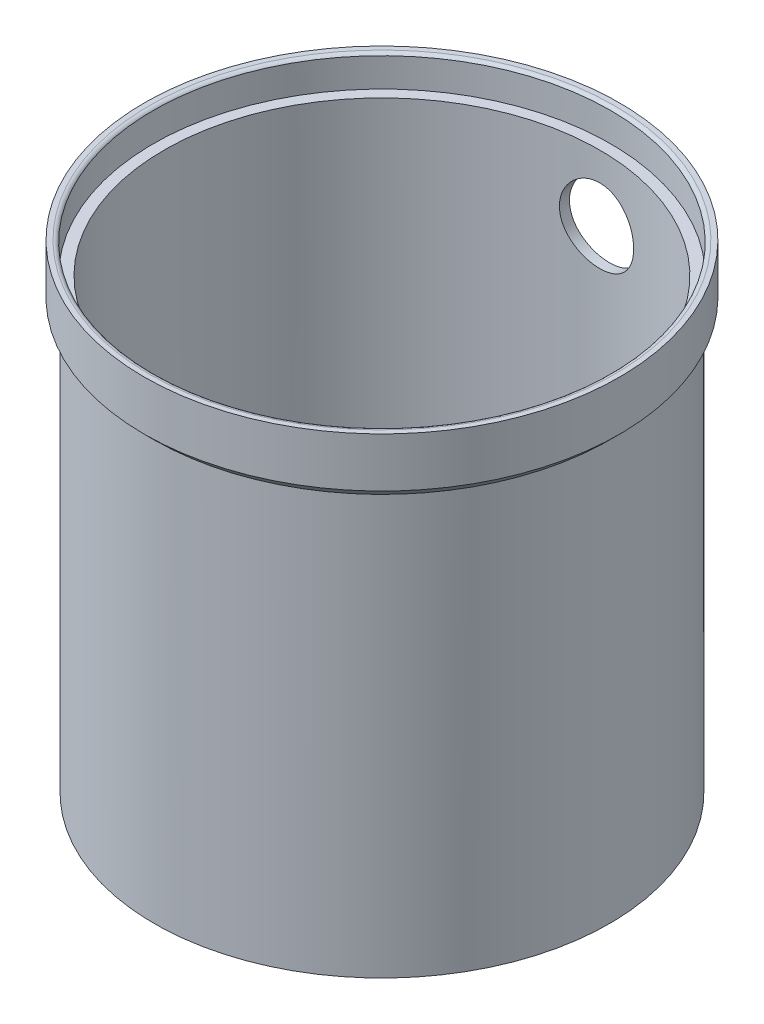
ISO-10303-21;
HEADER;
FILE_DESCRIPTION(('STEP AP214'),'2;1');
FILE_NAME('part.step','',(''),(''),'','','');
FILE_SCHEMA(('AUTOMOTIVE_DESIGN { 1 0 10303 214 1 1 1 1 }'));
ENDSEC;
DATA;
#1=APPLICATION_CONTEXT('core data for automotive mechanical design processes');
#2=APPLICATION_PROTOCOL_DEFINITION('international standard','automotive_design',2000,#1);
#3=PRODUCT_CONTEXT('',#1,'mechanical');
#4=PRODUCT('Part','Part','',(#3));
#5=PRODUCT_RELATED_PRODUCT_CATEGORY('part','',(#4));
#6=PRODUCT_DEFINITION_FORMATION('','',#4);
#7=PRODUCT_DEFINITION_CONTEXT('part definition',#1,'design');
#8=PRODUCT_DEFINITION('design','',#6,#7);
#9=PRODUCT_DEFINITION_SHAPE('','',#8);
#10=(LENGTH_UNIT() NAMED_UNIT(*) SI_UNIT(.MILLI.,.METRE.));
#11=(NAMED_UNIT(*) PLANE_ANGLE_UNIT() SI_UNIT($,.RADIAN.));
#12=(NAMED_UNIT(*) SI_UNIT($,.STERADIAN.) SOLID_ANGLE_UNIT());
#13=UNCERTAINTY_MEASURE_WITH_UNIT(LENGTH_MEASURE(1.E-05),#10,'distance_accuracy_value','');
#14=(GEOMETRIC_REPRESENTATION_CONTEXT(3) GLOBAL_UNCERTAINTY_ASSIGNED_CONTEXT((#13)) GLOBAL_UNIT_ASSIGNED_CONTEXT((#10,
#11,#12)) REPRESENTATION_CONTEXT('',''));
#15=CARTESIAN_POINT('',(0.,0.,0.));
#16=DIRECTION('',(0.,0.,1.));
#17=DIRECTION('',(1.,0.,0.));
#18=AXIS2_PLACEMENT_3D('',#15,#16,#17);
#19=CARTESIAN_POINT('',(0.,74.2,0.));
#20=DIRECTION('',(0.,1.,0.));
#21=DIRECTION('',(0.,0.,1.));
#22=AXIS2_PLACEMENT_3D('',#19,#20,#21);
#23=TOROIDAL_SURFACE('',#22,37.6,0.8);
#24=CARTESIAN_POINT('',(0.,75.,0.));
#25=DIRECTION('',(0.,1.,0.));
#26=DIRECTION('',(0.,0.,1.));
#27=AXIS2_PLACEMENT_3D('',#24,#25,#26);
#28=CIRCLE('',#27,37.6);
#29=CARTESIAN_POINT('',(0.,75.,37.6));
#30=VERTEX_POINT('',#29);
#31=EDGE_CURVE('E43',#30,#30,#28,.F.);
#32=ORIENTED_EDGE('',*,*,#31,.F.);
#33=EDGE_LOOP('',(#32));
#34=FACE_BOUND('',#33,.T.);
#35=CARTESIAN_POINT('',(0.,74.6663689526545,0.));
#36=DIRECTION('',(0.,-1.,0.));
#37=DIRECTION('',(0.,0.,-1.));
#38=AXIS2_PLACEMENT_3D('',#35,#36,#37);
#39=CIRCLE('',#38,36.95);
#40=CARTESIAN_POINT('',(0.,74.6663689526545,-36.95));
#41=VERTEX_POINT('',#40);
#42=EDGE_CURVE('E39',#41,#41,#39,.T.);
#43=ORIENTED_EDGE('',*,*,#42,.T.);
#44=EDGE_LOOP('',(#43));
#45=FACE_BOUND('',#44,.T.);
#46=ADVANCED_FACE('F35',(#34,#45),#23,.T.);
#47=CARTESIAN_POINT('',(0.,70.,0.));
#48=DIRECTION('',(0.,-1.,0.));
#49=DIRECTION('',(0.,0.,-1.));
#50=AXIS2_PLACEMENT_3D('',#47,#48,#49);
#51=CYLINDRICAL_SURFACE('',#50,36.8);
#52=CARTESIAN_POINT('',(0.,65.4,0.));
#53=DIRECTION('',(0.,1.,0.));
#54=DIRECTION('',(0.,0.,1.));
#55=AXIS2_PLACEMENT_3D('',#52,#53,#54);
#56=CIRCLE('',#55,36.8);
#57=CARTESIAN_POINT('',(0.,65.4,-36.8));
#58=VERTEX_POINT('',#57);
#59=EDGE_CURVE('E122',#58,#58,#56,.F.);
#60=ORIENTED_EDGE('',*,*,#59,.T.);
#61=CARTESIAN_POINT('',(0.,65.4,-36.8));
#62=CARTESIAN_POINT('',(-0.167379502400647,65.4000025104169,-36.8000010705405));
#63=CARTESIAN_POINT('',(-0.334724755541256,65.3929938209701,-36.7988559176553));
#64=CARTESIAN_POINT('',(-0.668265105705263,65.3650165208069,-36.794309602854));
#65=CARTESIAN_POINT('',(-0.834459965001257,65.3440451068931,-36.7909079879245));
#66=CARTESIAN_POINT('',(-1.16455937968949,65.2882801792838,-36.781939732632));
#67=CARTESIAN_POINT('',(-1.32846239464322,65.2534777918275,-36.7763717023751));
#68=CARTESIAN_POINT('',(-1.65277006004401,65.1703018453572,-36.7632247953928));
#69=CARTESIAN_POINT('',(-1.81317340375014,65.1219233075465,-36.7556451810122));
#70=CARTESIAN_POINT('',(-2.12910212654443,65.0120285046059,-36.738697891564));
#71=CARTESIAN_POINT('',(-2.28463305287706,64.9505278523386,-36.7293323428194));
#72=CARTESIAN_POINT('',(-2.58999374281213,64.8147817012781,-36.7090637018151));
#73=CARTESIAN_POINT('',(-2.73982138057351,64.7405315059694,-36.698160043231));
#74=CARTESIAN_POINT('',(-3.03261373380982,64.579876891852,-36.6751252372869));
#75=CARTESIAN_POINT('',(-3.17558185057908,64.4934785819974,-36.6629947077421));
#76=CARTESIAN_POINT('',(-3.45381710777184,64.3090745648335,-36.6378311365647));
#77=CARTESIAN_POINT('',(-3.58908135831187,64.2110645436395,-36.6247977602657));
#78=CARTESIAN_POINT('',(-3.85196561832089,64.0033298393285,-36.5980867841785));
#79=CARTESIAN_POINT('',(-3.9795174106852,63.8935193665289,-36.5844049360367));
#80=CARTESIAN_POINT('',(-4.22498502900374,63.6635429103554,-36.5568702765524));
#81=CARTESIAN_POINT('',(-4.34289727035992,63.5433731085449,-36.5430174037964));
#82=CARTESIAN_POINT('',(-4.56818760812465,63.2935769529694,-36.5155383331682));
#83=CARTESIAN_POINT('',(-4.67556890914976,63.1639534970648,-36.5019120673931));
#84=CARTESIAN_POINT('',(-4.87912940730948,62.8960561507011,-36.4752606655068));
#85=CARTESIAN_POINT('',(-4.97530445823978,62.7577790873928,-36.4622357529598));
#86=CARTESIAN_POINT('',(-5.15622628368947,62.4727796492382,-36.4370926742023));
#87=CARTESIAN_POINT('',(-5.24090701038183,62.326014851213,-36.4249799129024));
#88=CARTESIAN_POINT('',(-5.39762195948985,62.0257147319839,-36.4020871800492));
#89=CARTESIAN_POINT('',(-5.46965145959476,61.8721769092621,-36.3913077066129));
#90=CARTESIAN_POINT('',(-5.60046245278367,61.5595158683461,-36.3714064958991));
#91=CARTESIAN_POINT('',(-5.65924951049938,61.4003950288112,-36.3622840626268));
#92=CARTESIAN_POINT('',(-5.76318483858863,61.0776470561121,-36.3459547656866));
#93=CARTESIAN_POINT('',(-5.80832812645802,60.9140183004678,-36.3387486019273));
#94=CARTESIAN_POINT('',(-5.92198666129998,60.4211637322987,-36.3204660588543));
#95=CARTESIAN_POINT('',(-5.97003784893662,60.0868327523692,-36.3125197098996));
#96=CARTESIAN_POINT('',(-6.00942380550643,59.4149495845593,-36.306021300474));
#97=CARTESIAN_POINT('',(-6.00076241618712,59.0773976164176,-36.3074686036708));
#98=CARTESIAN_POINT('',(-5.92744685517449,58.4119400719097,-36.319508645484));
#99=CARTESIAN_POINT('',(-5.863345068187,58.0839722278961,-36.330011158617));
#100=CARTESIAN_POINT('',(-5.68181456574631,57.4435227637854,-36.3588414200932));
#101=CARTESIAN_POINT('',(-5.56438409324843,57.1310416543131,-36.3771694262653));
#102=CARTESIAN_POINT('',(-5.27897154123598,56.5287598165481,-36.4196824154256));
#103=CARTESIAN_POINT('',(-5.11075898527784,56.239070249099,-36.4438940014251));
#104=CARTESIAN_POINT('',(-4.72871951907739,55.6918204370566,-36.4954277860605));
#105=CARTESIAN_POINT('',(-4.51488908225229,55.4342626789189,-36.5227502251109));
#106=CARTESIAN_POINT('',(-4.04466849399494,54.9553871821923,-36.5778241829149));
#107=CARTESIAN_POINT('',(-3.78780404411893,54.73453504619,-36.6055769496218));
#108=CARTESIAN_POINT('',(-3.24041367380291,54.3389981898965,-36.6580849555046));
#109=CARTESIAN_POINT('',(-2.94988755343645,54.1643137438288,-36.6828401768755));
#110=CARTESIAN_POINT('',(-2.34299078956486,53.8660326453873,-36.726596809978));
#111=CARTESIAN_POINT('',(-2.02660016471902,53.7424759464937,-36.7455937188211));
#112=CARTESIAN_POINT('',(-1.37717986164191,53.5503835948365,-36.7756568252604));
#113=CARTESIAN_POINT('',(-1.04415151705093,53.4818435395617,-36.7867236574251));
#114=CARTESIAN_POINT('',(-0.374923533469688,53.40235852658,-36.7995946401197));
#115=CARTESIAN_POINT('',(-0.0388017431908669,53.3907741790613,-36.8015016143988));
#116=CARTESIAN_POINT('',(0.630581028563658,53.4238264834979,-36.7961192525689));
#117=CARTESIAN_POINT('',(0.963842114770074,53.4684610683572,-36.7888302545835));
#118=CARTESIAN_POINT('',(1.61607710562687,53.6121524127982,-36.7659385880065));
#119=CARTESIAN_POINT('',(1.93512233484675,53.7108937611208,-36.7503841181009));
#120=CARTESIAN_POINT('',(2.55213018743915,53.9596603945014,-36.7126988884816));
#121=CARTESIAN_POINT('',(2.85009166847176,54.1096884557639,-36.6905677727755));
#122=CARTESIAN_POINT('',(3.41925906692175,54.4582418928705,-36.6419301321133));
#123=CARTESIAN_POINT('',(3.69021644296168,54.6571680662361,-36.6153880665172));
#124=CARTESIAN_POINT('',(4.19513081681129,55.097319311781,-36.5609831106165));
#125=CARTESIAN_POINT('',(4.42908524745295,55.3385473163053,-36.5331201288442));
#126=CARTESIAN_POINT('',(4.85571329917306,55.8593130612828,-36.4788824655137));
#127=CARTESIAN_POINT('',(5.0479556734624,56.1392061601435,-36.4525252328465));
#128=CARTESIAN_POINT('',(5.38269242814043,56.7277018817876,-36.4046060604531));
#129=CARTESIAN_POINT('',(5.52518833546757,57.0363036230078,-36.3830439735501));
#130=CARTESIAN_POINT('',(5.75574261255356,57.6721687549556,-36.3472839276365));
#131=CARTESIAN_POINT('',(5.84401838867326,57.9993517933673,-36.3330565958599));
#132=CARTESIAN_POINT('',(5.96429150260154,58.6643388789088,-36.3135112361705));
#133=CARTESIAN_POINT('',(5.99629350282524,59.0021420437752,-36.3081924701637));
#134=CARTESIAN_POINT('',(6.0013829696215,59.506917538766,-36.307343956729));
#135=CARTESIAN_POINT('',(5.9960723149273,59.6739383859752,-36.3082252880731));
#136=CARTESIAN_POINT('',(5.97155493405967,60.0069123779766,-36.3122669850973));
#137=CARTESIAN_POINT('',(5.95235342441563,60.1728658999922,-36.3154264952355));
#138=CARTESIAN_POINT('',(5.90018554405459,60.5025860498475,-36.3239383162528));
#139=CARTESIAN_POINT('',(5.86721424825465,60.666351873556,-36.3292914117055));
#140=CARTESIAN_POINT('',(5.78777470241246,60.9904352320881,-36.3420319047357));
#141=CARTESIAN_POINT('',(5.74131131553284,61.1507539870682,-36.3494185692728));
#142=CARTESIAN_POINT('',(5.63526736787457,61.466765819258,-36.3660093498908));
#143=CARTESIAN_POINT('',(5.57569622448701,61.6224621268231,-36.3752121606573));
#144=CARTESIAN_POINT('',(5.44387744359313,61.9282216321091,-36.3951732731103));
#145=CARTESIAN_POINT('',(5.37163435269657,62.0782868268716,-36.4059310166545));
#146=CARTESIAN_POINT('',(5.2149434841611,62.3718786316506,-36.4287061407479));
#147=CARTESIAN_POINT('',(5.13049095147288,62.515402665392,-36.4407240115589));
#148=CARTESIAN_POINT('',(4.95002708145606,62.7948320608544,-36.4656759557506));
#149=CARTESIAN_POINT('',(4.85401981640323,62.9307400821082,-36.4786097056872));
#150=CARTESIAN_POINT('',(4.64989148294004,63.195628309231,-36.5051944659567));
#151=CARTESIAN_POINT('',(4.54164151522518,63.3245085371675,-36.5188521107623));
#152=CARTESIAN_POINT('',(4.31475373212098,63.5726677129873,-36.546353447211));
#153=CARTESIAN_POINT('',(4.19611964582905,63.6919500783166,-36.5601970705667));
#154=CARTESIAN_POINT('',(3.94917093008504,63.9202143234384,-36.5876958685921));
#155=CARTESIAN_POINT('',(3.82085056285604,64.0291900104795,-36.6013509258074));
#156=CARTESIAN_POINT('',(3.55552009560744,64.2359648172348,-36.6280772838614));
#157=CARTESIAN_POINT('',(3.41851322103613,64.3337680481143,-36.6411487983427));
#158=CARTESIAN_POINT('',(3.13572188622102,64.518197108902,-36.6664360961328));
#159=CARTESIAN_POINT('',(2.98988287810668,64.6047402370984,-36.6786452763393));
#160=CARTESIAN_POINT('',(2.69137914128866,64.7651822730117,-36.7017557982771));
#161=CARTESIAN_POINT('',(2.53871694942568,64.8390858315636,-36.7126576206185));
#162=CARTESIAN_POINT('',(2.22769842371621,64.9736924061442,-36.7328411160269));
#163=CARTESIAN_POINT('',(2.06934618292025,65.0344046980366,-36.742123926642));
#164=CARTESIAN_POINT('',(1.74803435793424,65.1422207155977,-36.7588121612646));
#165=CARTESIAN_POINT('',(1.58507578044437,65.1893273898688,-36.7662179920075));
#166=CARTESIAN_POINT('',(1.18829150458764,65.2859974814475,-36.7815414066276));
#167=CARTESIAN_POINT('',(0.952719099418756,65.3286983319468,-36.7884313916199));
#168=CARTESIAN_POINT('',(0.478074481517521,65.3856975708614,-36.7976598874467));
#169=CARTESIAN_POINT('',(0.239002325046639,65.3999964153588,-36.7999984713679));
#170=CARTESIAN_POINT('',(0.,65.4,-36.8));
#171=B_SPLINE_CURVE_WITH_KNOTS('',3,(#61,#62,#63,#64,#65,#66,#67,#68,#69,#70,#71,#72,#73,#74,
#75,#76,#77,#78,#79,#80,#81,#82,#83,#84,#85,#86,#87,#88,#89,#90,#91,#92,#93,#94,#95,#96,#97,#98,
#99,#100,#101,#102,#103,#104,#105,#106,#107,#108,#109,#110,#111,#112,#113,#114,#115,#116,#117,
#118,#119,#120,#121,#122,#123,#124,#125,#126,#127,#128,#129,#130,#131,#132,#133,#134,#135,#136,
#137,#138,#139,#140,#141,#142,#143,#144,#145,#146,#147,#148,#149,#150,#151,#152,#153,#154,#155,
#156,#157,#158,#159,#160,#161,#162,#163,#164,#165,#166,#167,#168,#169,#170),.UNSPECIFIED.,.T.,
.F.,(4,2,2,2,2,2,2,2,2,2,2,2,2,2,2,2,2,2,2,2,2,2,2,2,2,2,2,2,2,2,2,2,2,2,2,2,2,2,2,2,2,2,2,2,2,
2,2,2,2,2,2,2,2,2,4),(0.,0.501929050266932,1.00395889967381,1.50631136580925,2.00884830152795,
2.51079061371921,3.01291822329726,3.51479422377039,4.01685726510777,4.52285504909154,
5.02904014734791,5.53507072991348,6.04128794835958,6.55030083339255,7.05950331522916,
7.56849142331037,8.07766518239634,9.08593060671923,10.0941277311811,11.0923938366255,
12.0906928347882,13.0935925621534,14.0965698488292,15.111432213846,16.1263006067345,
17.1419605717393,18.1575392540598,19.1616905098942,20.1658048454878,21.1641270992055,
22.1625034017335,23.1693530805759,24.1762725814163,25.1931526218697,26.2100014470456,
27.2227459341838,28.2354065090974,28.7362410808246,29.2368876682323,29.7377134770558,
30.2383589891058,30.7386459753685,31.2387538278175,31.7390569779613,32.2391843179849,
32.7451788774095,33.2509924660885,33.7571080665708,34.2630368260105,34.7724936782077,
35.2817626663132,35.7906723781808,36.2994717164988,37.0161911159083,37.7328990060721),.UNSPECIFIED.);
#172=EDGE_CURVE('E47',#58,#58,#171,.T.);
#173=ORIENTED_EDGE('',*,*,#172,.T.);
#174=EDGE_LOOP('',(#60,#173));
#175=FACE_BOUND('',#174,.T.);
#176=CARTESIAN_POINT('',(0.,-2.3,0.));
#177=DIRECTION('',(0.,-1.,0.));
#178=DIRECTION('',(0.,0.,-1.));
#179=AXIS2_PLACEMENT_3D('',#176,#177,#178);
#180=CIRCLE('',#179,36.8);
#181=CARTESIAN_POINT('',(0.,-2.3,-36.8));
#182=VERTEX_POINT('',#181);
#183=EDGE_CURVE('E139',#182,#182,#180,.T.);
#184=ORIENTED_EDGE('',*,*,#183,.F.);
#185=EDGE_LOOP('',(#184));
#186=FACE_BOUND('',#185,.T.);
#187=ADVANCED_FACE('F66',(#175,#186),#51,.T.);
#188=CARTESIAN_POINT('',(0.,70.,0.));
#189=DIRECTION('',(0.,1.,0.));
#190=DIRECTION('',(0.,0.,1.));
#191=AXIS2_PLACEMENT_3D('',#188,#189,#190);
#192=PLANE('',#191);
#193=CARTESIAN_POINT('',(0.,70.,0.));
#194=DIRECTION('',(0.,1.,0.));
#195=DIRECTION('',(0.,0.,1.));
#196=AXIS2_PLACEMENT_3D('',#193,#194,#195);
#197=CIRCLE('',#196,35.2);
#198=CARTESIAN_POINT('',(0.,70.,35.2));
#199=VERTEX_POINT('',#198);
#200=EDGE_CURVE('E126',#199,#199,#197,.T.);
#201=ORIENTED_EDGE('',*,*,#200,.F.);
#202=EDGE_LOOP('',(#201));
#203=FACE_BOUND('',#202,.T.);
#204=CARTESIAN_POINT('',(0.,70.,0.));
#205=DIRECTION('',(0.,1.,0.));
#206=DIRECTION('',(0.,0.,1.));
#207=AXIS2_PLACEMENT_3D('',#204,#205,#206);
#208=CIRCLE('',#207,36.95);
#209=CARTESIAN_POINT('',(0.,70.,36.95));
#210=VERTEX_POINT('',#209);
#211=EDGE_CURVE('E51',#210,#210,#208,.T.);
#212=ORIENTED_EDGE('',*,*,#211,.T.);
#213=EDGE_LOOP('',(#212));
#214=FACE_BOUND('',#213,.T.);
#215=ADVANCED_FACE('F98',(#203,#214),#192,.T.);
#216=CARTESIAN_POINT('',(0.,70.,0.));
#217=DIRECTION('',(0.,-1.,0.));
#218=DIRECTION('',(0.,0.,-1.));
#219=AXIS2_PLACEMENT_3D('',#216,#217,#218);
#220=CYLINDRICAL_SURFACE('',#219,35.2);
#221=CARTESIAN_POINT('',(0.,65.4,-35.2));
#222=CARTESIAN_POINT('',(-0.167269846309063,65.4000026518599,-35.2000011757502));
#223=CARTESIAN_POINT('',(-0.334504090697048,65.3930030682291,-35.1988055093664));
#224=CARTESIAN_POINT('',(-0.667821667675684,65.3650629572513,-35.1940587814457));
#225=CARTESIAN_POINT('',(-0.83390476953724,65.3441197123487,-35.1905072607641));
#226=CARTESIAN_POINT('',(-1.16377612249944,65.2884316216283,-35.1811437864091));
#227=CARTESIAN_POINT('',(-1.32756288830248,65.2536782343173,-35.1753304338523));
#228=CARTESIAN_POINT('',(-1.65163868386078,65.1706220885016,-35.1616040884577));
#229=CARTESIAN_POINT('',(-1.81192640666089,65.1223143574767,-35.1536903251249));
#230=CARTESIAN_POINT('',(-2.12762190467819,65.0125856924281,-35.1359956830679));
#231=CARTESIAN_POINT('',(-2.28303536409721,64.9511807377653,-35.1262170810791));
#232=CARTESIAN_POINT('',(-2.58816722040877,64.8156504082222,-35.1050536278189));
#233=CARTESIAN_POINT('',(-2.737883493461,64.7415203452476,-35.0936681848423));
#234=CARTESIAN_POINT('',(-3.03046501099092,64.5811292990958,-35.0696139186702));
#235=CARTESIAN_POINT('',(-3.17333358211834,64.4948742880485,-35.0569457281446));
#236=CARTESIAN_POINT('',(-3.45138471819708,64.3107794859763,-35.0306644996825));
#237=CARTESIAN_POINT('',(-3.58656439639836,64.2129353858402,-35.0170511110813));
#238=CARTESIAN_POINT('',(-3.84939482899662,64.0054780917304,-34.9891379847931));
#239=CARTESIAN_POINT('',(-3.97697113835005,63.8957712290164,-34.9748333652087));
#240=CARTESIAN_POINT('',(-4.22249827728077,63.6660037798644,-34.9460412096182));
#241=CARTESIAN_POINT('',(-4.34044552542382,63.5459393748814,-34.9315536078463));
#242=CARTESIAN_POINT('',(-4.5658190845414,63.2963520088022,-34.9028107894559));
#243=CARTESIAN_POINT('',(-4.67324856600094,63.166831918715,-34.8885555038945));
#244=CARTESIAN_POINT('',(-4.87691964651366,62.8991358156532,-34.8606687722127));
#245=CARTESIAN_POINT('',(-4.97315710469759,62.7609566278644,-34.8470375581125));
#246=CARTESIAN_POINT('',(-5.15427119894958,62.4760610808683,-34.820711051436));
#247=CARTESIAN_POINT('',(-5.23907488685792,62.3292977504124,-34.8080219810152));
#248=CARTESIAN_POINT('',(-5.39603429462171,62.0289801039025,-34.7840354156596));
#249=CARTESIAN_POINT('',(-5.46818528758727,61.875423276597,-34.7727384412613));
#250=CARTESIAN_POINT('',(-5.59923433602594,61.5627038124823,-34.7518775089671));
#251=CARTESIAN_POINT('',(-5.6581380233396,61.4035435912596,-34.7423128149632));
#252=CARTESIAN_POINT('',(-5.76229862384259,61.0806967409474,-34.7251876925554));
#253=CARTESIAN_POINT('',(-5.80755055778364,60.917008484039,-34.7176279955618));
#254=CARTESIAN_POINT('',(-5.921454578065,60.4242136261074,-34.6984523092699));
#255=CARTESIAN_POINT('',(-5.96967020902436,60.0899859238515,-34.6901064313419));
#256=CARTESIAN_POINT('',(-6.00941035906783,59.4182715999704,-34.6832431255959));
#257=CARTESIAN_POINT('',(-6.00093907453615,59.0807852214233,-34.684724970257));
#258=CARTESIAN_POINT('',(-5.92805979405199,58.4157576820503,-34.6972538635166));
#259=CARTESIAN_POINT('',(-5.86425693319586,58.08814847584,-34.7081974298504));
#260=CARTESIAN_POINT('',(-5.68345568000718,57.4483666681173,-34.7382591650506));
#261=CARTESIAN_POINT('',(-5.56645538687804,57.1361946186317,-34.7573776260125));
#262=CARTESIAN_POINT('',(-5.28197594262085,56.5343277809638,-34.8017449760008));
#263=CARTESIAN_POINT('',(-5.11424664928673,56.244753532811,-34.8270241202585));
#264=CARTESIAN_POINT('',(-4.73324646500109,55.6976317676141,-34.8808440110762));
#265=CARTESIAN_POINT('',(-4.51997173341347,55.440086954364,-34.9093850326008));
#266=CARTESIAN_POINT('',(-4.05064309077592,54.9608309583231,-34.9669669575854));
#267=CARTESIAN_POINT('',(-3.79407010624864,54.7396279817498,-34.996009542641));
#268=CARTESIAN_POINT('',(-3.24718031288637,54.3433358170693,-35.0509803468071));
#269=CARTESIAN_POINT('',(-2.95686326769985,54.1682469519845,-35.0769085441011));
#270=CARTESIAN_POINT('',(-2.35023952085103,53.869101884826,-35.1227685197062));
#271=CARTESIAN_POINT('',(-2.033909563492,53.7450919559351,-35.1426948564693));
#272=CARTESIAN_POINT('',(-1.38449598068693,53.5521038842256,-35.174262583194));
#273=CARTESIAN_POINT('',(-1.05141382474959,53.4831209233416,-35.1859046984981));
#274=CARTESIAN_POINT('',(-0.382329720038626,53.4028370846073,-35.1994943324319));
#275=CARTESIAN_POINT('',(-0.0464137548655637,53.3908387763663,-35.2015590605567));
#276=CARTESIAN_POINT('',(0.622627822916665,53.4230034844575,-35.196082784525));
#277=CARTESIAN_POINT('',(0.955753547457757,53.4671642369738,-35.1885421675676));
#278=CARTESIAN_POINT('',(1.60759414778917,53.6098134180028,-35.1647751096178));
#279=CARTESIAN_POINT('',(1.92638707147401,53.7079552389284,-35.1486041030538));
#280=CARTESIAN_POINT('',(2.54299462560237,53.9554102942403,-35.1093821140088));
#281=CARTESIAN_POINT('',(2.84080803222288,54.1047265108681,-35.0863307305768));
#282=CARTESIAN_POINT('',(3.41002300686784,54.4518794861485,-35.035613909345));
#283=CARTESIAN_POINT('',(3.6811561994642,54.6501502534001,-35.0079079497221));
#284=CARTESIAN_POINT('',(4.18655130648268,55.0889900410912,-34.9510741659496));
#285=CARTESIAN_POINT('',(4.42081040905238,55.3295622842926,-34.9219462335885));
#286=CARTESIAN_POINT('',(4.8484045358002,55.8493047685161,-34.8651705026101));
#287=CARTESIAN_POINT('',(5.04126749651887,56.1288658104691,-34.837542213561));
#288=CARTESIAN_POINT('',(5.37729245489318,56.7168409030501,-34.7872637728417));
#289=CARTESIAN_POINT('',(5.52045607962863,57.0252540086862,-34.7646134582092));
#290=CARTESIAN_POINT('',(5.75232434405739,57.6608156219959,-34.7270005766922));
#291=CARTESIAN_POINT('',(5.84126069893726,57.9878777890769,-34.7120053447408));
#292=CARTESIAN_POINT('',(5.96285602768514,58.6527638941919,-34.6913290728123));
#293=CARTESIAN_POINT('',(5.99552014205583,58.99058684635,-34.6856471820584));
#294=CARTESIAN_POINT('',(6.00157481408918,59.495283353047,-34.6845920175847));
#295=CARTESIAN_POINT('',(5.99659449275729,59.6621631793007,-34.6854573712663));
#296=CARTESIAN_POINT('',(5.972761057247,59.9948827686265,-34.6895707561932));
#297=CARTESIAN_POINT('',(5.95391316069719,60.1607228992192,-34.6928178912999));
#298=CARTESIAN_POINT('',(5.90247423928091,60.4902438311376,-34.7016060781081));
#299=CARTESIAN_POINT('',(5.8698783163453,60.6539238414131,-34.7071479473516));
#300=CARTESIAN_POINT('',(5.79120977294576,60.9778643888243,-34.720361186829));
#301=CARTESIAN_POINT('',(5.74514199880541,61.1381261334311,-34.7280317912274));
#302=CARTESIAN_POINT('',(5.63991932900022,61.4540208286817,-34.7452751587913));
#303=CARTESIAN_POINT('',(5.58077661225604,61.6096579349899,-34.7548461509625));
#304=CARTESIAN_POINT('',(5.44983737641118,61.9153346614699,-34.7756187909485));
#305=CARTESIAN_POINT('',(5.37804538397091,62.0653762608498,-34.7868198551783));
#306=CARTESIAN_POINT('',(5.22227672160188,62.3589611457037,-34.8105448320051));
#307=CARTESIAN_POINT('',(5.13829524427621,62.5025018378507,-34.8230692659918));
#308=CARTESIAN_POINT('',(4.9587895341838,62.7820088591526,-34.8490835569403));
#309=CARTESIAN_POINT('',(4.86326934866512,62.9179778198156,-34.862573074722));
#310=CARTESIAN_POINT('',(4.66002634069763,63.1831757670513,-34.8903253654964));
#311=CARTESIAN_POINT('',(4.55216318419203,63.3122964243199,-34.9045958168335));
#312=CARTESIAN_POINT('',(4.32603288285222,63.5609702378408,-34.9333425447845));
#313=CARTESIAN_POINT('',(4.20776946086249,63.6805267886002,-34.9478187462056));
#314=CARTESIAN_POINT('',(3.96154138598011,63.9093742516403,-34.976585865432));
#315=CARTESIAN_POINT('',(3.83357099411292,64.0186590041663,-34.9908766676861));
#316=CARTESIAN_POINT('',(3.56891366004074,64.226086675239,-35.0188599476665));
#317=CARTESIAN_POINT('',(3.43222995189031,64.324233690522,-35.0325526442436));
#318=CARTESIAN_POINT('',(3.14995917748064,64.5094489784159,-35.0590644533345));
#319=CARTESIAN_POINT('',(3.00431198687253,64.5964267313231,-35.071876079575));
#320=CARTESIAN_POINT('',(2.70614503339492,64.7577516176718,-35.0961414257257));
#321=CARTESIAN_POINT('',(2.55362782573344,64.8321033988841,-35.1075956448425));
#322=CARTESIAN_POINT('',(2.24284717980507,64.9676160313129,-35.1288181851924));
#323=CARTESIAN_POINT('',(2.08458776463867,65.0287859172031,-35.1385876602007));
#324=CARTESIAN_POINT('',(1.76341187908746,65.1375194956183,-35.1561696032951));
#325=CARTESIAN_POINT('',(1.60049640545006,65.1850860766305,-35.1639824867945));
#326=CARTESIAN_POINT('',(1.20132399499386,65.2834586361468,-35.1802753419649));
#327=CARTESIAN_POINT('',(0.963219877280581,65.3271089531483,-35.1876371497617));
#328=CARTESIAN_POINT('',(0.483385692448577,65.3853774508634,-35.1974985844832));
#329=CARTESIAN_POINT('',(0.241655692514739,65.3999961688431,-35.1999983013871));
#330=CARTESIAN_POINT('',(0.,65.4,-35.2));
#331=B_SPLINE_CURVE_WITH_KNOTS('',3,(#221,#222,#223,#224,#225,#226,#227,#228,#229,#230,#231,
#232,#233,#234,#235,#236,#237,#238,#239,#240,#241,#242,#243,#244,#245,#246,#247,#248,#249,#250,
#251,#252,#253,#254,#255,#256,#257,#258,#259,#260,#261,#262,#263,#264,#265,#266,#267,#268,#269,
#270,#271,#272,#273,#274,#275,#276,#277,#278,#279,#280,#281,#282,#283,#284,#285,#286,#287,#288,
#289,#290,#291,#292,#293,#294,#295,#296,#297,#298,#299,#300,#301,#302,#303,#304,#305,#306,#307,
#308,#309,#310,#311,#312,#313,#314,#315,#316,#317,#318,#319,#320,#321,#322,#323,#324,#325,#326,
#327,#328,#329,#330),.UNSPECIFIED.,.T.,.F.,(4,2,2,2,2,2,2,2,2,2,2,2,2,2,2,2,2,2,2,2,2,2,2,2,2,2,
2,2,2,2,2,2,2,2,2,2,2,2,2,2,2,2,2,2,2,2,2,2,2,2,2,2,2,2,4),(0.,0.50159768307372,
1.00329315386067,1.50529940455734,2.00749006162524,2.50907148675441,3.010838099116,
3.51235842726574,4.01406582201936,4.52007253874988,5.02626661027384,5.53230762133467,
6.03853526779236,6.54785357423859,7.05736175220171,7.5666529112431,8.0761296017462,
9.08417994527429,10.0921556662956,11.0892447013122,12.0863693661015,13.0884932625263,
14.0907016968149,15.1059115940684,16.121128602525,17.1372632993431,18.1533090154096,
19.1568868194766,20.1604241698156,21.157591870445,22.154817691953,23.1612236062472,
24.1677062273946,25.1851192398168,26.2024989405602,27.2155003028278,28.2284091219097,
28.7287903091024,29.2289833257662,29.7293546991038,30.2295462913002,30.7292739183787,
31.2288230751785,31.7285697866457,32.228141716168,32.7340974336686,33.2398727724485,
33.7459495030698,34.2518394785742,34.7616004579224,35.2711733794781,35.7803959286902,
36.2895102706134,37.0141846899367,37.7388456981318),.UNSPECIFIED.);
#332=CARTESIAN_POINT('',(0.,65.4,-35.2));
#333=VERTEX_POINT('',#332);
#334=EDGE_CURVE('E52',#333,#333,#331,.T.);
#335=ORIENTED_EDGE('',*,*,#334,.F.);
#336=EDGE_LOOP('',(#335));
#337=FACE_BOUND('',#336,.T.);
#338=CARTESIAN_POINT('',(0.,1.00000000000003,0.));
#339=DIRECTION('',(0.,1.,0.));
#340=DIRECTION('',(0.,0.,1.));
#341=AXIS2_PLACEMENT_3D('',#338,#339,#340);
#342=CIRCLE('',#341,35.2);
#343=CARTESIAN_POINT('',(0.,1.00000000000003,35.2));
#344=VERTEX_POINT('',#343);
#345=EDGE_CURVE('E11',#344,#344,#342,.F.);
#346=ORIENTED_EDGE('',*,*,#345,.T.);
#347=EDGE_LOOP('',(#346));
#348=FACE_BOUND('',#347,.T.);
#349=ORIENTED_EDGE('',*,*,#200,.T.);
#350=EDGE_LOOP('',(#349));
#351=FACE_BOUND('',#350,.T.);
#352=ADVANCED_FACE('F94',(#337,#348,#351),#220,.F.);
#353=CARTESIAN_POINT('',(0.,65.,0.));
#354=DIRECTION('',(0.,1.,0.));
#355=DIRECTION('',(0.,0.,1.));
#356=AXIS2_PLACEMENT_3D('',#353,#354,#355);
#357=CYLINDRICAL_SURFACE('',#356,38.4);
#358=CARTESIAN_POINT('',(0.,67.,0.));
#359=DIRECTION('',(0.,1.,0.));
#360=DIRECTION('',(0.,0.,1.));
#361=AXIS2_PLACEMENT_3D('',#358,#359,#360);
#362=CIRCLE('',#361,38.4);
#363=CARTESIAN_POINT('',(0.,67.,38.4));
#364=VERTEX_POINT('',#363);
#365=EDGE_CURVE('E125',#364,#364,#362,.T.);
#366=ORIENTED_EDGE('',*,*,#365,.T.);
#367=EDGE_LOOP('',(#366));
#368=FACE_BOUND('',#367,.T.);
#369=CARTESIAN_POINT('',(0.,75.,0.));
#370=DIRECTION('',(0.,1.,0.));
#371=DIRECTION('',(0.,0.,1.));
#372=AXIS2_PLACEMENT_3D('',#369,#370,#371);
#373=CIRCLE('',#372,38.4);
#374=CARTESIAN_POINT('',(0.,75.,38.4));
#375=VERTEX_POINT('',#374);
#376=EDGE_CURVE('E130',#375,#375,#373,.T.);
#377=ORIENTED_EDGE('',*,*,#376,.F.);
#378=EDGE_LOOP('',(#377));
#379=FACE_BOUND('',#378,.T.);
#380=ADVANCED_FACE('F91',(#368,#379),#357,.T.);
#381=CARTESIAN_POINT('',(0.,75.,0.));
#382=DIRECTION('',(0.,1.,0.));
#383=DIRECTION('',(0.,0.,1.));
#384=AXIS2_PLACEMENT_3D('',#381,#382,#383);
#385=PLANE('',#384);
#386=ORIENTED_EDGE('',*,*,#31,.T.);
#387=EDGE_LOOP('',(#386));
#388=FACE_BOUND('',#387,.T.);
#389=ORIENTED_EDGE('',*,*,#376,.T.);
#390=EDGE_LOOP('',(#389));
#391=FACE_BOUND('',#390,.T.);
#392=ADVANCED_FACE('F88',(#388,#391),#385,.T.);
#393=CARTESIAN_POINT('',(0.,67.,0.));
#394=DIRECTION('',(0.,1.,0.));
#395=DIRECTION('',(0.,0.,1.));
#396=AXIS2_PLACEMENT_3D('',#393,#394,#395);
#397=CONICAL_SURFACE('',#396,38.4,0.785398163397445);
#398=ORIENTED_EDGE('',*,*,#59,.F.);
#399=EDGE_LOOP('',(#398));
#400=FACE_BOUND('',#399,.T.);
#401=ORIENTED_EDGE('',*,*,#365,.F.);
#402=EDGE_LOOP('',(#401));
#403=FACE_BOUND('',#402,.T.);
#404=ADVANCED_FACE('F86',(#400,#403),#397,.T.);
#405=CARTESIAN_POINT('',(0.,-2.3,0.));
#406=DIRECTION('',(0.,-1.,0.));
#407=DIRECTION('',(0.,0.,-1.));
#408=AXIS2_PLACEMENT_3D('',#405,#406,#407);
#409=PLANE('',#408);
#410=ORIENTED_EDGE('',*,*,#183,.T.);
#411=EDGE_LOOP('',(#410));
#412=FACE_BOUND('',#411,.T.);
#413=CARTESIAN_POINT('',(0.,-2.3,0.));
#414=DIRECTION('',(0.,-1.,0.));
#415=DIRECTION('',(0.,0.,-1.));
#416=AXIS2_PLACEMENT_3D('',#413,#414,#415);
#417=CIRCLE('',#416,36.2);
#418=CARTESIAN_POINT('',(0.,-2.3,-36.2));
#419=VERTEX_POINT('',#418);
#420=EDGE_CURVE('E141',#419,#419,#417,.T.);
#421=ORIENTED_EDGE('',*,*,#420,.F.);
#422=EDGE_LOOP('',(#421));
#423=FACE_BOUND('',#422,.T.);
#424=ADVANCED_FACE('F82',(#412,#423),#409,.T.);
#425=CARTESIAN_POINT('',(0.,-2.3,0.));
#426=DIRECTION('',(0.,1.,0.));
#427=DIRECTION('',(0.,0.,1.));
#428=AXIS2_PLACEMENT_3D('',#425,#426,#427);
#429=CYLINDRICAL_SURFACE('',#428,36.2);
#430=ORIENTED_EDGE('',*,*,#420,.T.);
#431=EDGE_LOOP('',(#430));
#432=FACE_BOUND('',#431,.T.);
#433=CARTESIAN_POINT('',(0.,0.,0.));
#434=DIRECTION('',(0.,-1.,0.));
#435=DIRECTION('',(0.,0.,-1.));
#436=AXIS2_PLACEMENT_3D('',#433,#434,#435);
#437=CIRCLE('',#436,36.2);
#438=CARTESIAN_POINT('',(0.,0.,-36.2));
#439=VERTEX_POINT('',#438);
#440=EDGE_CURVE('E144',#439,#439,#437,.T.);
#441=ORIENTED_EDGE('',*,*,#440,.F.);
#442=EDGE_LOOP('',(#441));
#443=FACE_BOUND('',#442,.T.);
#444=ADVANCED_FACE('F79',(#432,#443),#429,.F.);
#445=CARTESIAN_POINT('',(0.,0.,0.));
#446=DIRECTION('',(0.,-1.,0.));
#447=DIRECTION('',(0.,0.,-1.));
#448=AXIS2_PLACEMENT_3D('',#445,#446,#447);
#449=CONICAL_SURFACE('',#448,36.2,0.785398163397435);
#450=ORIENTED_EDGE('',*,*,#345,.F.);
#451=EDGE_LOOP('',(#450));
#452=FACE_BOUND('',#451,.T.);
#453=ORIENTED_EDGE('',*,*,#440,.T.);
#454=EDGE_LOOP('',(#453));
#455=FACE_BOUND('',#454,.T.);
#456=ADVANCED_FACE('F37',(#452,#455),#449,.F.);
#457=CARTESIAN_POINT('',(0.,80.,0.));
#458=DIRECTION('',(0.,-1.,0.));
#459=DIRECTION('',(0.,0.,-1.));
#460=AXIS2_PLACEMENT_3D('',#457,#458,#459);
#461=CYLINDRICAL_SURFACE('',#460,36.95);
#462=ORIENTED_EDGE('',*,*,#42,.F.);
#463=EDGE_LOOP('',(#462));
#464=FACE_BOUND('',#463,.T.);
#465=ORIENTED_EDGE('',*,*,#211,.F.);
#466=EDGE_LOOP('',(#465));
#467=FACE_BOUND('',#466,.T.);
#468=ADVANCED_FACE('F73',(#464,#467),#461,.F.);
#469=CARTESIAN_POINT('',(0.,59.4,-26.8));
#470=DIRECTION('',(0.,0.,-1.));
#471=DIRECTION('',(-1.,0.,0.));
#472=AXIS2_PLACEMENT_3D('',#469,#470,#471);
#473=CYLINDRICAL_SURFACE('',#472,6.);
#474=ORIENTED_EDGE('',*,*,#334,.T.);
#475=EDGE_LOOP('',(#474));
#476=FACE_BOUND('',#475,.T.);
#477=ORIENTED_EDGE('',*,*,#172,.F.);
#478=EDGE_LOOP('',(#477));
#479=FACE_BOUND('',#478,.T.);
#480=ADVANCED_FACE('F48',(#476,#479),#473,.F.);
#481=CLOSED_SHELL('',(#46,#187,#215,#352,#380,#392,#404,#424,#444,#456,#468,#480));
#482=MANIFOLD_SOLID_BREP('B2',#481);
#483=ADVANCED_BREP_SHAPE_REPRESENTATION('',(#18,#482),#14);
#484=SHAPE_DEFINITION_REPRESENTATION(#9,#483);
ENDSEC;
END-ISO-10303-21;
